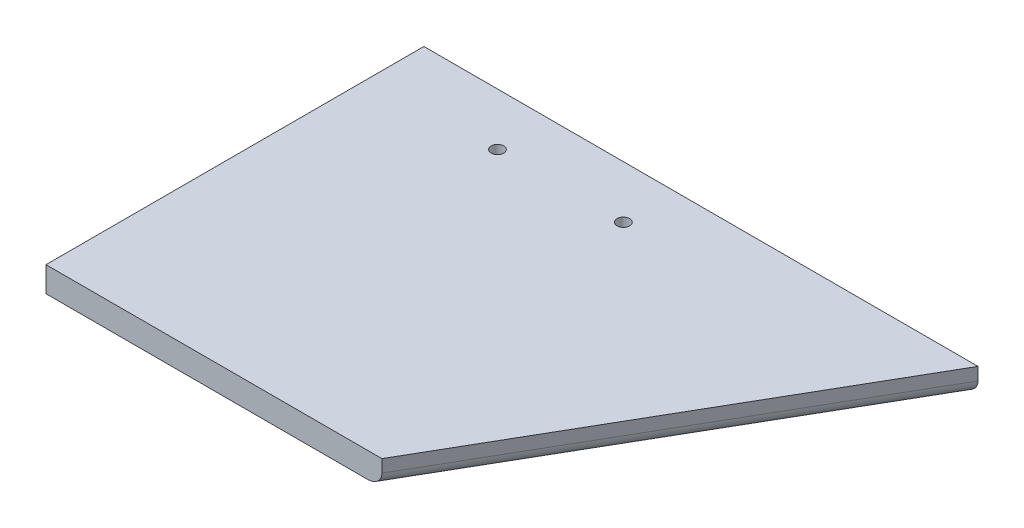
ISO-10303-21;
HEADER;
FILE_DESCRIPTION(('STEP AP214'),'2;1');
FILE_NAME('part.step','',(''),(''),'','','');
FILE_SCHEMA(('AUTOMOTIVE_DESIGN { 1 0 10303 214 1 1 1 1 }'));
ENDSEC;
DATA;
#1=APPLICATION_CONTEXT('core data for automotive mechanical design processes');
#2=APPLICATION_PROTOCOL_DEFINITION('international standard','automotive_design',2000,#1);
#3=PRODUCT_CONTEXT('',#1,'mechanical');
#4=PRODUCT('Part','Part','',(#3));
#5=PRODUCT_RELATED_PRODUCT_CATEGORY('part','',(#4));
#6=PRODUCT_DEFINITION_FORMATION('','',#4);
#7=PRODUCT_DEFINITION_CONTEXT('part definition',#1,'design');
#8=PRODUCT_DEFINITION('design','',#6,#7);
#9=PRODUCT_DEFINITION_SHAPE('','',#8);
#10=(LENGTH_UNIT() NAMED_UNIT(*) SI_UNIT(.MILLI.,.METRE.));
#11=(NAMED_UNIT(*) PLANE_ANGLE_UNIT() SI_UNIT($,.RADIAN.));
#12=(NAMED_UNIT(*) SI_UNIT($,.STERADIAN.) SOLID_ANGLE_UNIT());
#13=UNCERTAINTY_MEASURE_WITH_UNIT(LENGTH_MEASURE(1.E-05),#10,'distance_accuracy_value','');
#14=(GEOMETRIC_REPRESENTATION_CONTEXT(3) GLOBAL_UNCERTAINTY_ASSIGNED_CONTEXT((#13)) GLOBAL_UNIT_ASSIGNED_CONTEXT((#10,
#11,#12)) REPRESENTATION_CONTEXT('',''));
#15=CARTESIAN_POINT('',(0.,0.,0.));
#16=DIRECTION('',(0.,0.,1.));
#17=DIRECTION('',(1.,0.,0.));
#18=AXIS2_PLACEMENT_3D('',#15,#16,#17);
#19=CARTESIAN_POINT('',(0.,6.,0.));
#20=DIRECTION('',(0.,0.,-1.));
#21=DIRECTION('',(-1.,0.,0.));
#22=AXIS2_PLACEMENT_3D('',#19,#20,#21);
#23=PLANE('',#22);
#24=DIRECTION('',(1.,0.,0.));
#25=VECTOR('',#24,1.);
#26=CARTESIAN_POINT('',(0.,0.,0.));
#27=LINE('',#26,#25);
#28=CARTESIAN_POINT('',(-80.,0.,0.));
#29=VERTEX_POINT('',#28);
#30=CARTESIAN_POINT('',(-3.46410161513776,0.,0.));
#31=VERTEX_POINT('',#30);
#32=EDGE_CURVE('E138',#29,#31,#27,.T.);
#33=ORIENTED_EDGE('',*,*,#32,.T.);
#34=CARTESIAN_POINT('',(-3.46410161513776,3.,0.));
#35=DIRECTION('',(0.,0.,-1.));
#36=DIRECTION('',(-1.,0.,0.));
#37=AXIS2_PLACEMENT_3D('',#34,#35,#36);
#38=ELLIPSE('',#37,3.46410161513776,3.);
#39=CARTESIAN_POINT('',(0.,3.,0.));
#40=VERTEX_POINT('',#39);
#41=EDGE_CURVE('E11',#31,#40,#38,.F.);
#42=ORIENTED_EDGE('',*,*,#41,.T.);
#43=DIRECTION('',(0.,-1.,0.));
#44=VECTOR('',#43,1.);
#45=CARTESIAN_POINT('',(0.,6.,0.));
#46=LINE('',#45,#44);
#47=CARTESIAN_POINT('',(0.,6.,0.));
#48=VERTEX_POINT('',#47);
#49=EDGE_CURVE('E95',#48,#40,#46,.T.);
#50=ORIENTED_EDGE('',*,*,#49,.F.);
#51=DIRECTION('',(1.,0.,0.));
#52=VECTOR('',#51,1.);
#53=CARTESIAN_POINT('',(0.,6.,0.));
#54=LINE('',#53,#52);
#55=CARTESIAN_POINT('',(-80.,6.,0.));
#56=VERTEX_POINT('',#55);
#57=EDGE_CURVE('E102',#56,#48,#54,.T.);
#58=ORIENTED_EDGE('',*,*,#57,.F.);
#59=DIRECTION('',(0.,-1.,0.));
#60=VECTOR('',#59,1.);
#61=CARTESIAN_POINT('',(-80.,6.,0.));
#62=LINE('',#61,#60);
#63=EDGE_CURVE('E130',#56,#29,#62,.T.);
#64=ORIENTED_EDGE('',*,*,#63,.T.);
#65=EDGE_LOOP('',(#33,#42,#50,#58,#64));
#66=FACE_BOUND('',#65,.T.);
#67=ADVANCED_FACE('F43',(#66),#23,.F.);
#68=CARTESIAN_POINT('',(0.,6.,0.));
#69=DIRECTION('',(-0.866025403784436,0.,-0.500000000000004));
#70=DIRECTION('',(-0.500000000000004,0.,0.866025403784436));
#71=AXIS2_PLACEMENT_3D('',#68,#69,#70);
#72=PLANE('',#71);
#73=ORIENTED_EDGE('',*,*,#49,.T.);
#74=DIRECTION('',(0.500000000000004,0.,-0.866025403784436));
#75=VECTOR('',#74,1.);
#76=CARTESIAN_POINT('',(51.9615242270669,3.,-90.));
#77=LINE('',#76,#75);
#78=CARTESIAN_POINT('',(51.9615242270669,3.,-90.));
#79=VERTEX_POINT('',#78);
#80=EDGE_CURVE('E116',#40,#79,#77,.T.);
#81=ORIENTED_EDGE('',*,*,#80,.T.);
#82=DIRECTION('',(0.,-1.,0.));
#83=VECTOR('',#82,1.);
#84=CARTESIAN_POINT('',(51.9615242270669,6.,-90.));
#85=LINE('',#84,#83);
#86=CARTESIAN_POINT('',(51.9615242270669,6.,-90.));
#87=VERTEX_POINT('',#86);
#88=EDGE_CURVE('E97',#87,#79,#85,.T.);
#89=ORIENTED_EDGE('',*,*,#88,.F.);
#90=DIRECTION('',(0.500000000000004,0.,-0.866025403784436));
#91=VECTOR('',#90,1.);
#92=CARTESIAN_POINT('',(0.,6.,0.));
#93=LINE('',#92,#91);
#94=EDGE_CURVE('E90',#48,#87,#93,.T.);
#95=ORIENTED_EDGE('',*,*,#94,.F.);
#96=EDGE_LOOP('',(#73,#81,#89,#95));
#97=FACE_BOUND('',#96,.T.);
#98=ADVANCED_FACE('F92',(#97),#72,.F.);
#99=CARTESIAN_POINT('',(0.,6.,-90.));
#100=DIRECTION('',(0.,0.,1.));
#101=DIRECTION('',(1.,0.,0.));
#102=AXIS2_PLACEMENT_3D('',#99,#100,#101);
#103=PLANE('',#102);
#104=ORIENTED_EDGE('',*,*,#88,.T.);
#105=CARTESIAN_POINT('',(48.4974226119291,3.,-90.));
#106=DIRECTION('',(0.,0.,1.));
#107=DIRECTION('',(-1.,0.,0.));
#108=AXIS2_PLACEMENT_3D('',#105,#106,#107);
#109=ELLIPSE('',#108,3.46410161513776,3.);
#110=CARTESIAN_POINT('',(48.4974226119291,0.,-90.));
#111=VERTEX_POINT('',#110);
#112=EDGE_CURVE('E66',#79,#111,#109,.F.);
#113=ORIENTED_EDGE('',*,*,#112,.T.);
#114=DIRECTION('',(-1.,0.,0.));
#115=VECTOR('',#114,1.);
#116=CARTESIAN_POINT('',(0.,0.,-90.));
#117=LINE('',#116,#115);
#118=CARTESIAN_POINT('',(-80.,0.,-90.));
#119=VERTEX_POINT('',#118);
#120=EDGE_CURVE('E135',#111,#119,#117,.T.);
#121=ORIENTED_EDGE('',*,*,#120,.T.);
#122=DIRECTION('',(0.,-1.,0.));
#123=VECTOR('',#122,1.);
#124=CARTESIAN_POINT('',(-80.,6.,-90.));
#125=LINE('',#124,#123);
#126=CARTESIAN_POINT('',(-80.,6.,-90.));
#127=VERTEX_POINT('',#126);
#128=EDGE_CURVE('E121',#127,#119,#125,.T.);
#129=ORIENTED_EDGE('',*,*,#128,.F.);
#130=DIRECTION('',(-1.,0.,0.));
#131=VECTOR('',#130,1.);
#132=CARTESIAN_POINT('',(51.9615242270669,6.,-90.));
#133=LINE('',#132,#131);
#134=EDGE_CURVE('E101',#87,#127,#133,.T.);
#135=ORIENTED_EDGE('',*,*,#134,.F.);
#136=EDGE_LOOP('',(#104,#113,#121,#129,#135));
#137=FACE_BOUND('',#136,.T.);
#138=ADVANCED_FACE('F190',(#137),#103,.F.);
#139=CARTESIAN_POINT('',(-80.,6.,0.));
#140=DIRECTION('',(1.,0.,0.));
#141=DIRECTION('',(0.,0.,-1.));
#142=AXIS2_PLACEMENT_3D('',#139,#140,#141);
#143=PLANE('',#142);
#144=DIRECTION('',(0.,0.,1.));
#145=VECTOR('',#144,1.);
#146=CARTESIAN_POINT('',(-80.,0.,0.));
#147=LINE('',#146,#145);
#148=EDGE_CURVE('E112',#119,#29,#147,.T.);
#149=ORIENTED_EDGE('',*,*,#148,.T.);
#150=ORIENTED_EDGE('',*,*,#63,.F.);
#151=DIRECTION('',(0.,0.,1.));
#152=VECTOR('',#151,1.);
#153=CARTESIAN_POINT('',(-80.,6.,0.));
#154=LINE('',#153,#152);
#155=EDGE_CURVE('E107',#127,#56,#154,.T.);
#156=ORIENTED_EDGE('',*,*,#155,.F.);
#157=ORIENTED_EDGE('',*,*,#128,.T.);
#158=EDGE_LOOP('',(#149,#150,#156,#157));
#159=FACE_BOUND('',#158,.T.);
#160=ADVANCED_FACE('F174',(#159),#143,.F.);
#161=CARTESIAN_POINT('',(0.,6.,0.));
#162=DIRECTION('',(0.,-1.,0.));
#163=DIRECTION('',(0.,0.,-1.));
#164=AXIS2_PLACEMENT_3D('',#161,#162,#163);
#165=PLANE('',#164);
#166=CARTESIAN_POINT('',(-50.,6.,-77.5));
#167=DIRECTION('',(0.,1.,0.));
#168=DIRECTION('',(0.,0.,1.));
#169=AXIS2_PLACEMENT_3D('',#166,#167,#168);
#170=CIRCLE('',#169,1.5);
#171=CARTESIAN_POINT('',(-50.,6.,-76.));
#172=VERTEX_POINT('',#171);
#173=EDGE_CURVE('E154',#172,#172,#170,.T.);
#174=ORIENTED_EDGE('',*,*,#173,.F.);
#175=EDGE_LOOP('',(#174));
#176=FACE_BOUND('',#175,.T.);
#177=CARTESIAN_POINT('',(-20.,6.,-77.5));
#178=DIRECTION('',(0.,1.,0.));
#179=DIRECTION('',(0.,0.,1.));
#180=AXIS2_PLACEMENT_3D('',#177,#178,#179);
#181=CIRCLE('',#180,1.5);
#182=CARTESIAN_POINT('',(-20.,6.,-76.));
#183=VERTEX_POINT('',#182);
#184=EDGE_CURVE('E150',#183,#183,#181,.T.);
#185=ORIENTED_EDGE('',*,*,#184,.F.);
#186=EDGE_LOOP('',(#185));
#187=FACE_BOUND('',#186,.T.);
#188=ORIENTED_EDGE('',*,*,#57,.T.);
#189=ORIENTED_EDGE('',*,*,#94,.T.);
#190=ORIENTED_EDGE('',*,*,#134,.T.);
#191=ORIENTED_EDGE('',*,*,#155,.T.);
#192=EDGE_LOOP('',(#188,#189,#190,#191));
#193=FACE_BOUND('',#192,.T.);
#194=ADVANCED_FACE('F105',(#176,#187,#193),#165,.F.);
#195=CARTESIAN_POINT('',(0.,0.,0.));
#196=DIRECTION('',(0.,-1.,0.));
#197=DIRECTION('',(0.,0.,-1.));
#198=AXIS2_PLACEMENT_3D('',#195,#196,#197);
#199=PLANE('',#198);
#200=CARTESIAN_POINT('',(-50.,0.,-77.5));
#201=DIRECTION('',(0.,1.,0.));
#202=DIRECTION('',(0.,0.,1.));
#203=AXIS2_PLACEMENT_3D('',#200,#201,#202);
#204=CIRCLE('',#203,1.5);
#205=CARTESIAN_POINT('',(-50.,0.,-76.));
#206=VERTEX_POINT('',#205);
#207=EDGE_CURVE('E141',#206,#206,#204,.T.);
#208=ORIENTED_EDGE('',*,*,#207,.T.);
#209=EDGE_LOOP('',(#208));
#210=FACE_BOUND('',#209,.T.);
#211=CARTESIAN_POINT('',(-20.,0.,-77.5));
#212=DIRECTION('',(0.,1.,0.));
#213=DIRECTION('',(0.,0.,1.));
#214=AXIS2_PLACEMENT_3D('',#211,#212,#213);
#215=CIRCLE('',#214,1.5);
#216=CARTESIAN_POINT('',(-20.,0.,-76.));
#217=VERTEX_POINT('',#216);
#218=EDGE_CURVE('E146',#217,#217,#215,.T.);
#219=ORIENTED_EDGE('',*,*,#218,.T.);
#220=EDGE_LOOP('',(#219));
#221=FACE_BOUND('',#220,.T.);
#222=ORIENTED_EDGE('',*,*,#120,.F.);
#223=DIRECTION('',(0.500000000000004,0.,-0.866025403784436));
#224=VECTOR('',#223,1.);
#225=CARTESIAN_POINT('',(-2.59807621135331,0.,-1.50000000000001));
#226=LINE('',#225,#224);
#227=EDGE_CURVE('E52',#111,#31,#226,.F.);
#228=ORIENTED_EDGE('',*,*,#227,.T.);
#229=ORIENTED_EDGE('',*,*,#32,.F.);
#230=ORIENTED_EDGE('',*,*,#148,.F.);
#231=EDGE_LOOP('',(#222,#228,#229,#230));
#232=FACE_BOUND('',#231,.T.);
#233=ADVANCED_FACE('F162',(#210,#221,#232),#199,.T.);
#234=CARTESIAN_POINT('',(-2.59807621135331,3.,-1.50000000000001));
#235=DIRECTION('',(-0.500000000000004,0.,0.866025403784436));
#236=DIRECTION('',(0.866025403784436,0.,0.500000000000004));
#237=AXIS2_PLACEMENT_3D('',#234,#235,#236);
#238=CYLINDRICAL_SURFACE('',#237,3.);
#239=ORIENTED_EDGE('',*,*,#41,.F.);
#240=ORIENTED_EDGE('',*,*,#227,.F.);
#241=ORIENTED_EDGE('',*,*,#112,.F.);
#242=ORIENTED_EDGE('',*,*,#80,.F.);
#243=EDGE_LOOP('',(#239,#240,#241,#242));
#244=FACE_BOUND('',#243,.T.);
#245=ADVANCED_FACE('F45',(#244),#238,.T.);
#246=CARTESIAN_POINT('',(-20.,0.,-77.5));
#247=DIRECTION('',(0.,1.,0.));
#248=DIRECTION('',(0.,0.,1.));
#249=AXIS2_PLACEMENT_3D('',#246,#247,#248);
#250=CYLINDRICAL_SURFACE('',#249,1.5);
#251=ORIENTED_EDGE('',*,*,#218,.F.);
#252=EDGE_LOOP('',(#251));
#253=FACE_BOUND('',#252,.T.);
#254=ORIENTED_EDGE('',*,*,#184,.T.);
#255=EDGE_LOOP('',(#254));
#256=FACE_BOUND('',#255,.T.);
#257=ADVANCED_FACE('F168',(#253,#256),#250,.F.);
#258=CARTESIAN_POINT('',(-50.,0.,-77.5));
#259=DIRECTION('',(0.,1.,0.));
#260=DIRECTION('',(0.,0.,1.));
#261=AXIS2_PLACEMENT_3D('',#258,#259,#260);
#262=CYLINDRICAL_SURFACE('',#261,1.5);
#263=ORIENTED_EDGE('',*,*,#207,.F.);
#264=EDGE_LOOP('',(#263));
#265=FACE_BOUND('',#264,.T.);
#266=ORIENTED_EDGE('',*,*,#173,.T.);
#267=EDGE_LOOP('',(#266));
#268=FACE_BOUND('',#267,.T.);
#269=ADVANCED_FACE('F165',(#265,#268),#262,.F.);
#270=CLOSED_SHELL('',(#67,#98,#138,#160,#194,#233,#245,#257,#269));
#271=MANIFOLD_SOLID_BREP('B2',#270);
#272=ADVANCED_BREP_SHAPE_REPRESENTATION('',(#18,#271),#14);
#273=SHAPE_DEFINITION_REPRESENTATION(#9,#272);
ENDSEC;
END-ISO-10303-21;
